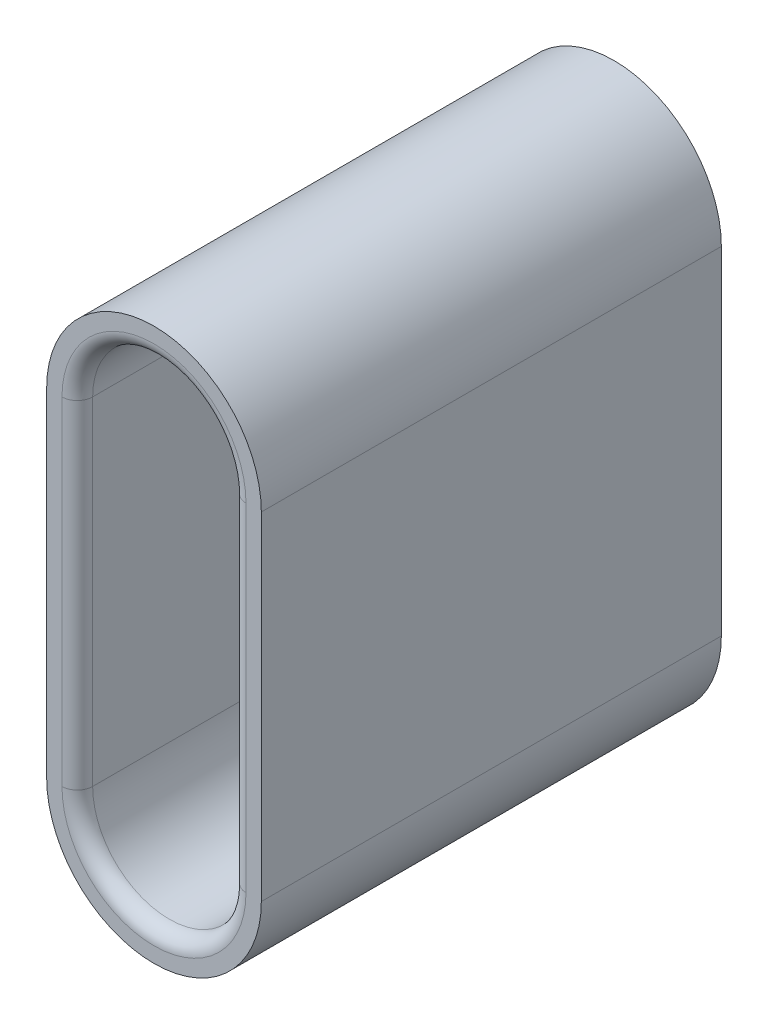
ISO-10303-21;
HEADER;
FILE_DESCRIPTION(('STEP AP214'),'2;1');
FILE_NAME('part.step','',(''),(''),'','','');
FILE_SCHEMA(('AUTOMOTIVE_DESIGN { 1 0 10303 214 1 1 1 1 }'));
ENDSEC;
DATA;
#1=APPLICATION_CONTEXT('core data for automotive mechanical design processes');
#2=APPLICATION_PROTOCOL_DEFINITION('international standard','automotive_design',2000,#1);
#3=PRODUCT_CONTEXT('',#1,'mechanical');
#4=PRODUCT('Part','Part','',(#3));
#5=PRODUCT_RELATED_PRODUCT_CATEGORY('part','',(#4));
#6=PRODUCT_DEFINITION_FORMATION('','',#4);
#7=PRODUCT_DEFINITION_CONTEXT('part definition',#1,'design');
#8=PRODUCT_DEFINITION('design','',#6,#7);
#9=PRODUCT_DEFINITION_SHAPE('','',#8);
#10=(LENGTH_UNIT() NAMED_UNIT(*) SI_UNIT(.MILLI.,.METRE.));
#11=(NAMED_UNIT(*) PLANE_ANGLE_UNIT() SI_UNIT($,.RADIAN.));
#12=(NAMED_UNIT(*) SI_UNIT($,.STERADIAN.) SOLID_ANGLE_UNIT());
#13=UNCERTAINTY_MEASURE_WITH_UNIT(LENGTH_MEASURE(1.E-05),#10,'distance_accuracy_value','');
#14=(GEOMETRIC_REPRESENTATION_CONTEXT(3) GLOBAL_UNCERTAINTY_ASSIGNED_CONTEXT((#13)) GLOBAL_UNIT_ASSIGNED_CONTEXT((#10,
#11,#12)) REPRESENTATION_CONTEXT('',''));
#15=CARTESIAN_POINT('',(0.,0.,0.));
#16=DIRECTION('',(0.,0.,1.));
#17=DIRECTION('',(1.,0.,0.));
#18=AXIS2_PLACEMENT_3D('',#15,#16,#17);
#19=CARTESIAN_POINT('',(3.5,0.,15.));
#20=DIRECTION('',(0.,0.,-1.));
#21=DIRECTION('',(-1.,0.,0.));
#22=AXIS2_PLACEMENT_3D('',#19,#20,#21);
#23=CYLINDRICAL_SURFACE('',#22,3.5);
#24=CARTESIAN_POINT('',(3.5,0.,0.));
#25=DIRECTION('',(0.,0.,1.));
#26=DIRECTION('',(1.,0.,0.));
#27=AXIS2_PLACEMENT_3D('',#24,#25,#26);
#28=CIRCLE('',#27,3.5);
#29=CARTESIAN_POINT('',(0.,0.,0.));
#30=VERTEX_POINT('',#29);
#31=CARTESIAN_POINT('',(7.,0.,0.));
#32=VERTEX_POINT('',#31);
#33=EDGE_CURVE('E148',#30,#32,#28,.T.);
#34=ORIENTED_EDGE('',*,*,#33,.T.);
#35=DIRECTION('',(0.,0.,-1.));
#36=VECTOR('',#35,1.);
#37=CARTESIAN_POINT('',(7.,0.,15.));
#38=LINE('',#37,#36);
#39=CARTESIAN_POINT('',(7.,0.,15.));
#40=VERTEX_POINT('',#39);
#41=EDGE_CURVE('E129',#40,#32,#38,.T.);
#42=ORIENTED_EDGE('',*,*,#41,.F.);
#43=CARTESIAN_POINT('',(3.5,0.,15.));
#44=DIRECTION('',(0.,0.,1.));
#45=DIRECTION('',(1.,0.,0.));
#46=AXIS2_PLACEMENT_3D('',#43,#44,#45);
#47=CIRCLE('',#46,3.5);
#48=CARTESIAN_POINT('',(0.,0.,15.));
#49=VERTEX_POINT('',#48);
#50=EDGE_CURVE('E136',#49,#40,#47,.T.);
#51=ORIENTED_EDGE('',*,*,#50,.F.);
#52=DIRECTION('',(0.,0.,-1.));
#53=VECTOR('',#52,1.);
#54=CARTESIAN_POINT('',(0.,0.,15.));
#55=LINE('',#54,#53);
#56=EDGE_CURVE('E237',#49,#30,#55,.T.);
#57=ORIENTED_EDGE('',*,*,#56,.T.);
#58=EDGE_LOOP('',(#34,#42,#51,#57));
#59=FACE_BOUND('',#58,.T.);
#60=ADVANCED_FACE('F33',(#59),#23,.T.);
#61=CARTESIAN_POINT('',(7.,11.,15.));
#62=DIRECTION('',(-1.,0.,0.));
#63=DIRECTION('',(0.,-1.,0.));
#64=AXIS2_PLACEMENT_3D('',#61,#62,#63);
#65=PLANE('',#64);
#66=DIRECTION('',(0.,1.,0.));
#67=VECTOR('',#66,1.);
#68=CARTESIAN_POINT('',(7.,11.,0.));
#69=LINE('',#68,#67);
#70=CARTESIAN_POINT('',(7.,11.,0.));
#71=VERTEX_POINT('',#70);
#72=EDGE_CURVE('E239',#32,#71,#69,.T.);
#73=ORIENTED_EDGE('',*,*,#72,.T.);
#74=DIRECTION('',(0.,0.,-1.));
#75=VECTOR('',#74,1.);
#76=CARTESIAN_POINT('',(7.,11.,15.));
#77=LINE('',#76,#75);
#78=CARTESIAN_POINT('',(7.,11.,15.));
#79=VERTEX_POINT('',#78);
#80=EDGE_CURVE('E132',#79,#71,#77,.T.);
#81=ORIENTED_EDGE('',*,*,#80,.F.);
#82=DIRECTION('',(0.,1.,0.));
#83=VECTOR('',#82,1.);
#84=CARTESIAN_POINT('',(7.,11.,15.));
#85=LINE('',#84,#83);
#86=EDGE_CURVE('E125',#40,#79,#85,.T.);
#87=ORIENTED_EDGE('',*,*,#86,.F.);
#88=ORIENTED_EDGE('',*,*,#41,.T.);
#89=EDGE_LOOP('',(#73,#81,#87,#88));
#90=FACE_BOUND('',#89,.T.);
#91=ADVANCED_FACE('F127',(#90),#65,.F.);
#92=CARTESIAN_POINT('',(3.5,11.,15.));
#93=DIRECTION('',(0.,0.,-1.));
#94=DIRECTION('',(-1.,0.,0.));
#95=AXIS2_PLACEMENT_3D('',#92,#93,#94);
#96=CYLINDRICAL_SURFACE('',#95,3.5);
#97=CARTESIAN_POINT('',(3.5,11.,0.));
#98=DIRECTION('',(0.,0.,1.));
#99=DIRECTION('',(1.,0.,0.));
#100=AXIS2_PLACEMENT_3D('',#97,#98,#99);
#101=CIRCLE('',#100,3.5);
#102=CARTESIAN_POINT('',(0.,11.,0.));
#103=VERTEX_POINT('',#102);
#104=EDGE_CURVE('E241',#71,#103,#101,.T.);
#105=ORIENTED_EDGE('',*,*,#104,.T.);
#106=DIRECTION('',(0.,0.,-1.));
#107=VECTOR('',#106,1.);
#108=CARTESIAN_POINT('',(0.,11.,15.));
#109=LINE('',#108,#107);
#110=CARTESIAN_POINT('',(0.,11.,15.));
#111=VERTEX_POINT('',#110);
#112=EDGE_CURVE('E153',#111,#103,#109,.T.);
#113=ORIENTED_EDGE('',*,*,#112,.F.);
#114=CARTESIAN_POINT('',(3.5,11.,15.));
#115=DIRECTION('',(0.,0.,1.));
#116=DIRECTION('',(1.,0.,0.));
#117=AXIS2_PLACEMENT_3D('',#114,#115,#116);
#118=CIRCLE('',#117,3.5);
#119=EDGE_CURVE('E135',#79,#111,#118,.T.);
#120=ORIENTED_EDGE('',*,*,#119,.F.);
#121=ORIENTED_EDGE('',*,*,#80,.T.);
#122=EDGE_LOOP('',(#105,#113,#120,#121));
#123=FACE_BOUND('',#122,.T.);
#124=ADVANCED_FACE('F253',(#123),#96,.T.);
#125=CARTESIAN_POINT('',(0.,0.,15.));
#126=DIRECTION('',(1.,0.,0.));
#127=DIRECTION('',(0.,0.,-1.));
#128=AXIS2_PLACEMENT_3D('',#125,#126,#127);
#129=PLANE('',#128);
#130=DIRECTION('',(0.,-1.,0.));
#131=VECTOR('',#130,1.);
#132=CARTESIAN_POINT('',(0.,0.,0.));
#133=LINE('',#132,#131);
#134=EDGE_CURVE('E145',#103,#30,#133,.T.);
#135=ORIENTED_EDGE('',*,*,#134,.T.);
#136=ORIENTED_EDGE('',*,*,#56,.F.);
#137=DIRECTION('',(0.,-1.,0.));
#138=VECTOR('',#137,1.);
#139=CARTESIAN_POINT('',(0.,0.,15.));
#140=LINE('',#139,#138);
#141=EDGE_CURVE('E141',#111,#49,#140,.T.);
#142=ORIENTED_EDGE('',*,*,#141,.F.);
#143=ORIENTED_EDGE('',*,*,#112,.T.);
#144=EDGE_LOOP('',(#135,#136,#142,#143));
#145=FACE_BOUND('',#144,.T.);
#146=ADVANCED_FACE('F248',(#145),#129,.F.);
#147=CARTESIAN_POINT('',(3.5,0.,15.));
#148=DIRECTION('',(0.,0.,1.));
#149=DIRECTION('',(1.,0.,0.));
#150=AXIS2_PLACEMENT_3D('',#147,#148,#149);
#151=PLANE('',#150);
#152=DIRECTION('',(0.,-1.,0.));
#153=VECTOR('',#152,1.);
#154=CARTESIAN_POINT('',(0.5,11.,15.));
#155=LINE('',#154,#153);
#156=CARTESIAN_POINT('',(0.5,0.,15.));
#157=VERTEX_POINT('',#156);
#158=CARTESIAN_POINT('',(0.5,11.,15.));
#159=VERTEX_POINT('',#158);
#160=EDGE_CURVE('E177',#157,#159,#155,.F.);
#161=ORIENTED_EDGE('',*,*,#160,.T.);
#162=CARTESIAN_POINT('',(3.5,11.,15.));
#163=DIRECTION('',(0.,0.,1.));
#164=DIRECTION('',(1.,0.,0.));
#165=AXIS2_PLACEMENT_3D('',#162,#163,#164);
#166=CIRCLE('',#165,3.);
#167=CARTESIAN_POINT('',(6.5,11.,15.));
#168=VERTEX_POINT('',#167);
#169=EDGE_CURVE('E182',#159,#168,#166,.F.);
#170=ORIENTED_EDGE('',*,*,#169,.T.);
#171=DIRECTION('',(0.,1.,0.));
#172=VECTOR('',#171,1.);
#173=CARTESIAN_POINT('',(6.5,0.,15.));
#174=LINE('',#173,#172);
#175=CARTESIAN_POINT('',(6.5,0.,15.));
#176=VERTEX_POINT('',#175);
#177=EDGE_CURVE('E57',#168,#176,#174,.F.);
#178=ORIENTED_EDGE('',*,*,#177,.T.);
#179=CARTESIAN_POINT('',(3.5,0.,15.));
#180=DIRECTION('',(0.,0.,1.));
#181=DIRECTION('',(1.,0.,0.));
#182=AXIS2_PLACEMENT_3D('',#179,#180,#181);
#183=CIRCLE('',#182,3.);
#184=EDGE_CURVE('E179',#176,#157,#183,.F.);
#185=ORIENTED_EDGE('',*,*,#184,.T.);
#186=EDGE_LOOP('',(#161,#170,#178,#185));
#187=FACE_BOUND('',#186,.T.);
#188=ORIENTED_EDGE('',*,*,#50,.T.);
#189=ORIENTED_EDGE('',*,*,#86,.T.);
#190=ORIENTED_EDGE('',*,*,#119,.T.);
#191=ORIENTED_EDGE('',*,*,#141,.T.);
#192=EDGE_LOOP('',(#188,#189,#190,#191));
#193=FACE_BOUND('',#192,.T.);
#194=ADVANCED_FACE('F139',(#187,#193),#151,.T.);
#195=CARTESIAN_POINT('',(3.5,0.,0.));
#196=DIRECTION('',(0.,0.,1.));
#197=DIRECTION('',(1.,0.,0.));
#198=AXIS2_PLACEMENT_3D('',#195,#196,#197);
#199=PLANE('',#198);
#200=DIRECTION('',(0.,1.,0.));
#201=VECTOR('',#200,1.);
#202=CARTESIAN_POINT('',(6.5,0.,0.));
#203=LINE('',#202,#201);
#204=CARTESIAN_POINT('',(6.5,0.,0.));
#205=VERTEX_POINT('',#204);
#206=CARTESIAN_POINT('',(6.5,11.,0.));
#207=VERTEX_POINT('',#206);
#208=EDGE_CURVE('E158',#205,#207,#203,.T.);
#209=ORIENTED_EDGE('',*,*,#208,.T.);
#210=CARTESIAN_POINT('',(3.5,11.,0.));
#211=DIRECTION('',(0.,0.,1.));
#212=DIRECTION('',(1.,0.,0.));
#213=AXIS2_PLACEMENT_3D('',#210,#211,#212);
#214=CIRCLE('',#213,3.);
#215=CARTESIAN_POINT('',(0.5,11.,0.));
#216=VERTEX_POINT('',#215);
#217=EDGE_CURVE('E160',#207,#216,#214,.T.);
#218=ORIENTED_EDGE('',*,*,#217,.T.);
#219=DIRECTION('',(0.,-1.,0.));
#220=VECTOR('',#219,1.);
#221=CARTESIAN_POINT('',(0.5,0.,0.));
#222=LINE('',#221,#220);
#223=CARTESIAN_POINT('',(0.5,0.,0.));
#224=VERTEX_POINT('',#223);
#225=EDGE_CURVE('E149',#216,#224,#222,.T.);
#226=ORIENTED_EDGE('',*,*,#225,.T.);
#227=CARTESIAN_POINT('',(3.5,0.,0.));
#228=DIRECTION('',(0.,0.,1.));
#229=DIRECTION('',(1.,0.,0.));
#230=AXIS2_PLACEMENT_3D('',#227,#228,#229);
#231=CIRCLE('',#230,3.);
#232=EDGE_CURVE('E151',#224,#205,#231,.T.);
#233=ORIENTED_EDGE('',*,*,#232,.T.);
#234=EDGE_LOOP('',(#209,#218,#226,#233));
#235=FACE_BOUND('',#234,.T.);
#236=ORIENTED_EDGE('',*,*,#33,.F.);
#237=ORIENTED_EDGE('',*,*,#134,.F.);
#238=ORIENTED_EDGE('',*,*,#104,.F.);
#239=ORIENTED_EDGE('',*,*,#72,.F.);
#240=EDGE_LOOP('',(#236,#237,#238,#239));
#241=FACE_BOUND('',#240,.T.);
#242=ADVANCED_FACE('F252',(#235,#241),#199,.F.);
#243=CARTESIAN_POINT('',(3.5,0.,0.));
#244=DIRECTION('',(0.,0.,1.));
#245=DIRECTION('',(1.,0.,0.));
#246=AXIS2_PLACEMENT_3D('',#243,#244,#245);
#247=CYLINDRICAL_SURFACE('',#246,2.5);
#248=DIRECTION('',(0.,0.,1.));
#249=VECTOR('',#248,1.);
#250=CARTESIAN_POINT('',(6.,0.,0.));
#251=LINE('',#250,#249);
#252=CARTESIAN_POINT('',(6.,0.,0.5));
#253=VERTEX_POINT('',#252);
#254=CARTESIAN_POINT('',(6.,0.,14.5));
#255=VERTEX_POINT('',#254);
#256=EDGE_CURVE('E195',#253,#255,#251,.T.);
#257=ORIENTED_EDGE('',*,*,#256,.F.);
#258=CARTESIAN_POINT('',(3.5,0.,0.5));
#259=DIRECTION('',(0.,0.,1.));
#260=DIRECTION('',(1.,0.,0.));
#261=AXIS2_PLACEMENT_3D('',#258,#259,#260);
#262=CIRCLE('',#261,2.5);
#263=CARTESIAN_POINT('',(1.,0.,0.5));
#264=VERTEX_POINT('',#263);
#265=EDGE_CURVE('E175',#253,#264,#262,.F.);
#266=ORIENTED_EDGE('',*,*,#265,.T.);
#267=DIRECTION('',(0.,0.,1.));
#268=VECTOR('',#267,1.);
#269=CARTESIAN_POINT('',(1.,0.,0.));
#270=LINE('',#269,#268);
#271=CARTESIAN_POINT('',(1.,0.,14.5));
#272=VERTEX_POINT('',#271);
#273=EDGE_CURVE('E228',#264,#272,#270,.T.);
#274=ORIENTED_EDGE('',*,*,#273,.T.);
#275=CARTESIAN_POINT('',(3.5,0.,14.5));
#276=DIRECTION('',(0.,0.,1.));
#277=DIRECTION('',(1.,0.,0.));
#278=AXIS2_PLACEMENT_3D('',#275,#276,#277);
#279=CIRCLE('',#278,2.5);
#280=EDGE_CURVE('E173',#272,#255,#279,.T.);
#281=ORIENTED_EDGE('',*,*,#280,.T.);
#282=EDGE_LOOP('',(#257,#266,#274,#281));
#283=FACE_BOUND('',#282,.T.);
#284=ADVANCED_FACE('F328',(#283),#247,.F.);
#285=CARTESIAN_POINT('',(1.,11.,0.));
#286=DIRECTION('',(-1.,0.,0.));
#287=DIRECTION('',(0.,0.,1.));
#288=AXIS2_PLACEMENT_3D('',#285,#286,#287);
#289=PLANE('',#288);
#290=ORIENTED_EDGE('',*,*,#273,.F.);
#291=DIRECTION('',(0.,-1.,0.));
#292=VECTOR('',#291,1.);
#293=CARTESIAN_POINT('',(1.,11.,0.5));
#294=LINE('',#293,#292);
#295=CARTESIAN_POINT('',(1.,11.,0.5));
#296=VERTEX_POINT('',#295);
#297=EDGE_CURVE('E11',#264,#296,#294,.F.);
#298=ORIENTED_EDGE('',*,*,#297,.T.);
#299=DIRECTION('',(0.,0.,1.));
#300=VECTOR('',#299,1.);
#301=CARTESIAN_POINT('',(1.,11.,0.));
#302=LINE('',#301,#300);
#303=CARTESIAN_POINT('',(1.,11.,14.5));
#304=VERTEX_POINT('',#303);
#305=EDGE_CURVE('E222',#296,#304,#302,.T.);
#306=ORIENTED_EDGE('',*,*,#305,.T.);
#307=DIRECTION('',(0.,-1.,0.));
#308=VECTOR('',#307,1.);
#309=CARTESIAN_POINT('',(1.,0.,14.5));
#310=LINE('',#309,#308);
#311=EDGE_CURVE('E42',#304,#272,#310,.T.);
#312=ORIENTED_EDGE('',*,*,#311,.T.);
#313=EDGE_LOOP('',(#290,#298,#306,#312));
#314=FACE_BOUND('',#313,.T.);
#315=ADVANCED_FACE('F226',(#314),#289,.F.);
#316=CARTESIAN_POINT('',(3.5,11.,0.));
#317=DIRECTION('',(0.,0.,1.));
#318=DIRECTION('',(1.,0.,0.));
#319=AXIS2_PLACEMENT_3D('',#316,#317,#318);
#320=CYLINDRICAL_SURFACE('',#319,2.5);
#321=ORIENTED_EDGE('',*,*,#305,.F.);
#322=CARTESIAN_POINT('',(3.5,11.,0.5));
#323=DIRECTION('',(0.,0.,1.));
#324=DIRECTION('',(1.,0.,0.));
#325=AXIS2_PLACEMENT_3D('',#322,#323,#324);
#326=CIRCLE('',#325,2.5);
#327=CARTESIAN_POINT('',(6.,11.,0.5));
#328=VERTEX_POINT('',#327);
#329=EDGE_CURVE('E166',#296,#328,#326,.F.);
#330=ORIENTED_EDGE('',*,*,#329,.T.);
#331=DIRECTION('',(0.,0.,1.));
#332=VECTOR('',#331,1.);
#333=CARTESIAN_POINT('',(6.,11.,0.));
#334=LINE('',#333,#332);
#335=CARTESIAN_POINT('',(6.,11.,14.5));
#336=VERTEX_POINT('',#335);
#337=EDGE_CURVE('E225',#328,#336,#334,.T.);
#338=ORIENTED_EDGE('',*,*,#337,.T.);
#339=CARTESIAN_POINT('',(3.5,11.,14.5));
#340=DIRECTION('',(0.,0.,1.));
#341=DIRECTION('',(1.,0.,0.));
#342=AXIS2_PLACEMENT_3D('',#339,#340,#341);
#343=CIRCLE('',#342,2.5);
#344=EDGE_CURVE('E163',#336,#304,#343,.T.);
#345=ORIENTED_EDGE('',*,*,#344,.T.);
#346=EDGE_LOOP('',(#321,#330,#338,#345));
#347=FACE_BOUND('',#346,.T.);
#348=ADVANCED_FACE('F221',(#347),#320,.F.);
#349=CARTESIAN_POINT('',(6.,0.,0.));
#350=DIRECTION('',(1.,0.,0.));
#351=DIRECTION('',(0.,0.,-1.));
#352=AXIS2_PLACEMENT_3D('',#349,#350,#351);
#353=PLANE('',#352);
#354=ORIENTED_EDGE('',*,*,#337,.F.);
#355=DIRECTION('',(0.,1.,0.));
#356=VECTOR('',#355,1.);
#357=CARTESIAN_POINT('',(6.,0.,0.5));
#358=LINE('',#357,#356);
#359=EDGE_CURVE('E171',#328,#253,#358,.F.);
#360=ORIENTED_EDGE('',*,*,#359,.T.);
#361=ORIENTED_EDGE('',*,*,#256,.T.);
#362=DIRECTION('',(0.,1.,0.));
#363=VECTOR('',#362,1.);
#364=CARTESIAN_POINT('',(6.,11.,14.5));
#365=LINE('',#364,#363);
#366=EDGE_CURVE('E169',#255,#336,#365,.T.);
#367=ORIENTED_EDGE('',*,*,#366,.T.);
#368=EDGE_LOOP('',(#354,#360,#361,#367));
#369=FACE_BOUND('',#368,.T.);
#370=ADVANCED_FACE('F282',(#369),#353,.F.);
#371=CARTESIAN_POINT('',(3.5,0.,0.5));
#372=DIRECTION('',(0.,0.,1.));
#373=DIRECTION('',(1.,0.,0.));
#374=AXIS2_PLACEMENT_3D('',#371,#372,#373);
#375=TOROIDAL_SURFACE('',#374,3.,0.5);
#376=CARTESIAN_POINT('',(0.5,0.,0.5));
#377=DIRECTION('',(0.,1.,0.));
#378=DIRECTION('',(-1.,0.,0.));
#379=AXIS2_PLACEMENT_3D('',#376,#377,#378);
#380=CIRCLE('',#379,0.5);
#381=EDGE_CURVE('E189',#264,#224,#380,.T.);
#382=ORIENTED_EDGE('',*,*,#381,.F.);
#383=ORIENTED_EDGE('',*,*,#265,.F.);
#384=CARTESIAN_POINT('',(6.5,0.,0.5));
#385=DIRECTION('',(0.,1.,0.));
#386=DIRECTION('',(0.,0.,1.));
#387=AXIS2_PLACEMENT_3D('',#384,#385,#386);
#388=CIRCLE('',#387,0.5);
#389=EDGE_CURVE('E192',#205,#253,#388,.T.);
#390=ORIENTED_EDGE('',*,*,#389,.F.);
#391=ORIENTED_EDGE('',*,*,#232,.F.);
#392=EDGE_LOOP('',(#382,#383,#390,#391));
#393=FACE_BOUND('',#392,.T.);
#394=ADVANCED_FACE('F278',(#393),#375,.T.);
#395=CARTESIAN_POINT('',(6.5,0.,0.5));
#396=DIRECTION('',(0.,1.,0.));
#397=DIRECTION('',(0.,0.,1.));
#398=AXIS2_PLACEMENT_3D('',#395,#396,#397);
#399=CYLINDRICAL_SURFACE('',#398,0.5);
#400=ORIENTED_EDGE('',*,*,#389,.T.);
#401=ORIENTED_EDGE('',*,*,#359,.F.);
#402=CARTESIAN_POINT('',(6.5,11.,0.5));
#403=DIRECTION('',(0.,1.,0.));
#404=DIRECTION('',(0.,0.,1.));
#405=AXIS2_PLACEMENT_3D('',#402,#403,#404);
#406=CIRCLE('',#405,0.5);
#407=EDGE_CURVE('E187',#207,#328,#406,.T.);
#408=ORIENTED_EDGE('',*,*,#407,.F.);
#409=ORIENTED_EDGE('',*,*,#208,.F.);
#410=EDGE_LOOP('',(#400,#401,#408,#409));
#411=FACE_BOUND('',#410,.T.);
#412=ADVANCED_FACE('F274',(#411),#399,.T.);
#413=CARTESIAN_POINT('',(0.5,0.,0.5));
#414=DIRECTION('',(0.,-1.,0.));
#415=DIRECTION('',(0.,0.,-1.));
#416=AXIS2_PLACEMENT_3D('',#413,#414,#415);
#417=CYLINDRICAL_SURFACE('',#416,0.5);
#418=ORIENTED_EDGE('',*,*,#381,.T.);
#419=ORIENTED_EDGE('',*,*,#225,.F.);
#420=CARTESIAN_POINT('',(0.5,11.,0.5));
#421=DIRECTION('',(0.,1.,0.));
#422=DIRECTION('',(0.,0.,1.));
#423=AXIS2_PLACEMENT_3D('',#420,#421,#422);
#424=CIRCLE('',#423,0.5);
#425=EDGE_CURVE('E185',#296,#216,#424,.T.);
#426=ORIENTED_EDGE('',*,*,#425,.F.);
#427=ORIENTED_EDGE('',*,*,#297,.F.);
#428=EDGE_LOOP('',(#418,#419,#426,#427));
#429=FACE_BOUND('',#428,.T.);
#430=ADVANCED_FACE('F270',(#429),#417,.T.);
#431=CARTESIAN_POINT('',(3.5,11.,0.5));
#432=DIRECTION('',(0.,0.,1.));
#433=DIRECTION('',(1.,0.,0.));
#434=AXIS2_PLACEMENT_3D('',#431,#432,#433);
#435=TOROIDAL_SURFACE('',#434,3.,0.5);
#436=ORIENTED_EDGE('',*,*,#407,.T.);
#437=ORIENTED_EDGE('',*,*,#329,.F.);
#438=ORIENTED_EDGE('',*,*,#425,.T.);
#439=ORIENTED_EDGE('',*,*,#217,.F.);
#440=EDGE_LOOP('',(#436,#437,#438,#439));
#441=FACE_BOUND('',#440,.T.);
#442=ADVANCED_FACE('F267',(#441),#435,.T.);
#443=CARTESIAN_POINT('',(3.5,0.,14.5));
#444=DIRECTION('',(0.,0.,1.));
#445=DIRECTION('',(1.,0.,0.));
#446=AXIS2_PLACEMENT_3D('',#443,#444,#445);
#447=TOROIDAL_SURFACE('',#446,3.,0.5);
#448=CARTESIAN_POINT('',(0.5,0.,14.5));
#449=DIRECTION('',(0.,1.,0.));
#450=DIRECTION('',(-1.,0.,0.));
#451=AXIS2_PLACEMENT_3D('',#448,#449,#450);
#452=CIRCLE('',#451,0.5);
#453=EDGE_CURVE('E198',#157,#272,#452,.T.);
#454=ORIENTED_EDGE('',*,*,#453,.F.);
#455=ORIENTED_EDGE('',*,*,#184,.F.);
#456=CARTESIAN_POINT('',(6.5,0.,14.5));
#457=DIRECTION('',(0.,1.,0.));
#458=DIRECTION('',(-1.,0.,0.));
#459=AXIS2_PLACEMENT_3D('',#456,#457,#458);
#460=CIRCLE('',#459,0.5);
#461=EDGE_CURVE('E37',#255,#176,#460,.T.);
#462=ORIENTED_EDGE('',*,*,#461,.F.);
#463=ORIENTED_EDGE('',*,*,#280,.F.);
#464=EDGE_LOOP('',(#454,#455,#462,#463));
#465=FACE_BOUND('',#464,.T.);
#466=ADVANCED_FACE('F35',(#465),#447,.T.);
#467=CARTESIAN_POINT('',(6.5,0.,14.5));
#468=DIRECTION('',(0.,-1.,0.));
#469=DIRECTION('',(0.,0.,-1.));
#470=AXIS2_PLACEMENT_3D('',#467,#468,#469);
#471=CYLINDRICAL_SURFACE('',#470,0.5);
#472=ORIENTED_EDGE('',*,*,#461,.T.);
#473=ORIENTED_EDGE('',*,*,#177,.F.);
#474=CARTESIAN_POINT('',(6.5,11.,14.5));
#475=DIRECTION('',(0.,1.,0.));
#476=DIRECTION('',(0.,0.,1.));
#477=AXIS2_PLACEMENT_3D('',#474,#475,#476);
#478=CIRCLE('',#477,0.5);
#479=EDGE_CURVE('E50',#336,#168,#478,.T.);
#480=ORIENTED_EDGE('',*,*,#479,.F.);
#481=ORIENTED_EDGE('',*,*,#366,.F.);
#482=EDGE_LOOP('',(#472,#473,#480,#481));
#483=FACE_BOUND('',#482,.T.);
#484=ADVANCED_FACE('F208',(#483),#471,.T.);
#485=CARTESIAN_POINT('',(0.5,11.,14.5));
#486=DIRECTION('',(0.,1.,0.));
#487=DIRECTION('',(0.,0.,1.));
#488=AXIS2_PLACEMENT_3D('',#485,#486,#487);
#489=CYLINDRICAL_SURFACE('',#488,0.5);
#490=ORIENTED_EDGE('',*,*,#453,.T.);
#491=ORIENTED_EDGE('',*,*,#311,.F.);
#492=CARTESIAN_POINT('',(0.5,11.,14.5));
#493=DIRECTION('',(0.,1.,0.));
#494=DIRECTION('',(0.,0.,1.));
#495=AXIS2_PLACEMENT_3D('',#492,#493,#494);
#496=CIRCLE('',#495,0.5);
#497=EDGE_CURVE('E196',#159,#304,#496,.T.);
#498=ORIENTED_EDGE('',*,*,#497,.F.);
#499=ORIENTED_EDGE('',*,*,#160,.F.);
#500=EDGE_LOOP('',(#490,#491,#498,#499));
#501=FACE_BOUND('',#500,.T.);
#502=ADVANCED_FACE('F213',(#501),#489,.T.);
#503=CARTESIAN_POINT('',(3.5,11.,14.5));
#504=DIRECTION('',(0.,0.,1.));
#505=DIRECTION('',(1.,0.,0.));
#506=AXIS2_PLACEMENT_3D('',#503,#504,#505);
#507=TOROIDAL_SURFACE('',#506,3.,0.5);
#508=ORIENTED_EDGE('',*,*,#479,.T.);
#509=ORIENTED_EDGE('',*,*,#169,.F.);
#510=ORIENTED_EDGE('',*,*,#497,.T.);
#511=ORIENTED_EDGE('',*,*,#344,.F.);
#512=EDGE_LOOP('',(#508,#509,#510,#511));
#513=FACE_BOUND('',#512,.T.);
#514=ADVANCED_FACE('F212',(#513),#507,.T.);
#515=CLOSED_SHELL('',(#60,#91,#124,#146,#194,#242,#284,#315,#348,#370,#394,#412,#430,#442,#466,
#484,#502,#514));
#516=MANIFOLD_SOLID_BREP('B2',#515);
#517=ADVANCED_BREP_SHAPE_REPRESENTATION('',(#18,#516),#14);
#518=SHAPE_DEFINITION_REPRESENTATION(#9,#517);
ENDSEC;
END-ISO-10303-21;
